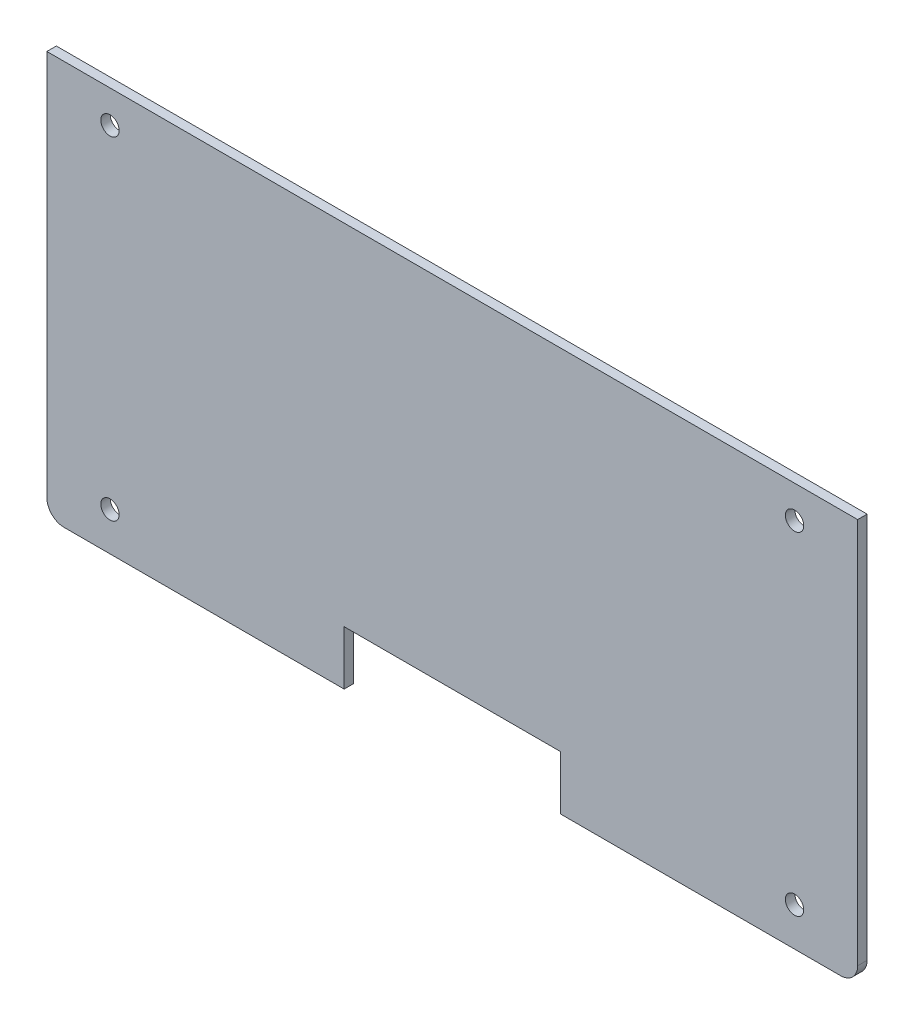
ISO-10303-21;
HEADER;
FILE_DESCRIPTION(('STEP AP214'),'2;1');
FILE_NAME('part.step','',(''),(''),'','','');
FILE_SCHEMA(('AUTOMOTIVE_DESIGN { 1 0 10303 214 1 1 1 1 }'));
ENDSEC;
DATA;
#1=APPLICATION_CONTEXT('core data for automotive mechanical design processes');
#2=APPLICATION_PROTOCOL_DEFINITION('international standard','automotive_design',2000,#1);
#3=PRODUCT_CONTEXT('',#1,'mechanical');
#4=PRODUCT('Part','Part','',(#3));
#5=PRODUCT_RELATED_PRODUCT_CATEGORY('part','',(#4));
#6=PRODUCT_DEFINITION_FORMATION('','',#4);
#7=PRODUCT_DEFINITION_CONTEXT('part definition',#1,'design');
#8=PRODUCT_DEFINITION('design','',#6,#7);
#9=PRODUCT_DEFINITION_SHAPE('','',#8);
#10=(LENGTH_UNIT() NAMED_UNIT(*) SI_UNIT(.MILLI.,.METRE.));
#11=(NAMED_UNIT(*) PLANE_ANGLE_UNIT() SI_UNIT($,.RADIAN.));
#12=(NAMED_UNIT(*) SI_UNIT($,.STERADIAN.) SOLID_ANGLE_UNIT());
#13=UNCERTAINTY_MEASURE_WITH_UNIT(LENGTH_MEASURE(1.E-05),#10,'distance_accuracy_value','');
#14=(GEOMETRIC_REPRESENTATION_CONTEXT(3) GLOBAL_UNCERTAINTY_ASSIGNED_CONTEXT((#13)) GLOBAL_UNIT_ASSIGNED_CONTEXT((#10,
#11,#12)) REPRESENTATION_CONTEXT('',''));
#15=CARTESIAN_POINT('',(0.,0.,0.));
#16=DIRECTION('',(0.,0.,1.));
#17=DIRECTION('',(1.,0.,0.));
#18=AXIS2_PLACEMENT_3D('',#15,#16,#17);
#19=CARTESIAN_POINT('',(0.,0.,0.));
#20=DIRECTION('',(0.,0.,-1.));
#21=DIRECTION('',(-1.,0.,0.));
#22=AXIS2_PLACEMENT_3D('',#19,#20,#21);
#23=PLANE('',#22);
#24=CARTESIAN_POINT('',(-63.325,7.12499999999954,0.));
#25=DIRECTION('',(0.,0.,1.));
#26=DIRECTION('',(1.,0.,0.));
#27=AXIS2_PLACEMENT_3D('',#24,#25,#26);
#28=CIRCLE('',#27,1.7);
#29=CARTESIAN_POINT('',(-61.625,7.12499999999954,0.));
#30=VERTEX_POINT('',#29);
#31=EDGE_CURVE('E224',#30,#30,#28,.T.);
#32=ORIENTED_EDGE('',*,*,#31,.F.);
#33=EDGE_LOOP('',(#32));
#34=FACE_BOUND('',#33,.T.);
#35=CARTESIAN_POINT('',(63.325,68.6599999999995,0.));
#36=DIRECTION('',(0.,0.,1.));
#37=DIRECTION('',(1.,0.,0.));
#38=AXIS2_PLACEMENT_3D('',#35,#36,#37);
#39=CIRCLE('',#38,1.69999999999999);
#40=CARTESIAN_POINT('',(65.025,68.6599999999995,0.));
#41=VERTEX_POINT('',#40);
#42=EDGE_CURVE('E218',#41,#41,#39,.T.);
#43=ORIENTED_EDGE('',*,*,#42,.F.);
#44=EDGE_LOOP('',(#43));
#45=FACE_BOUND('',#44,.T.);
#46=DIRECTION('',(0.,-1.,0.));
#47=VECTOR('',#46,1.);
#48=CARTESIAN_POINT('',(-75.,0.,0.));
#49=LINE('',#48,#47);
#50=CARTESIAN_POINT('',(-75.,74.6599999999995,0.));
#51=VERTEX_POINT('',#50);
#52=CARTESIAN_POINT('',(-75.,3.175,0.));
#53=VERTEX_POINT('',#52);
#54=EDGE_CURVE('E157',#51,#53,#49,.T.);
#55=ORIENTED_EDGE('',*,*,#54,.T.);
#56=CARTESIAN_POINT('',(-71.825,3.175,0.));
#57=DIRECTION('',(0.,0.,-1.));
#58=DIRECTION('',(-1.,0.,0.));
#59=AXIS2_PLACEMENT_3D('',#56,#57,#58);
#60=CIRCLE('',#59,3.175);
#61=CARTESIAN_POINT('',(-71.825,0.,0.));
#62=VERTEX_POINT('',#61);
#63=EDGE_CURVE('E188',#53,#62,#60,.F.);
#64=ORIENTED_EDGE('',*,*,#63,.T.);
#65=DIRECTION('',(1.,0.,0.));
#66=VECTOR('',#65,1.);
#67=CARTESIAN_POINT('',(-75.,0.,0.));
#68=LINE('',#67,#66);
#69=CARTESIAN_POINT('',(-20.,0.,0.));
#70=VERTEX_POINT('',#69);
#71=EDGE_CURVE('E173',#62,#70,#68,.T.);
#72=ORIENTED_EDGE('',*,*,#71,.T.);
#73=DIRECTION('',(0.,-1.,0.));
#74=VECTOR('',#73,1.);
#75=CARTESIAN_POINT('',(-20.,10.,0.));
#76=LINE('',#75,#74);
#77=CARTESIAN_POINT('',(-20.,10.,0.));
#78=VERTEX_POINT('',#77);
#79=EDGE_CURVE('E136',#78,#70,#76,.T.);
#80=ORIENTED_EDGE('',*,*,#79,.F.);
#81=DIRECTION('',(-1.,0.,0.));
#82=VECTOR('',#81,1.);
#83=CARTESIAN_POINT('',(-20.,10.,0.));
#84=LINE('',#83,#82);
#85=CARTESIAN_POINT('',(20.,10.,0.));
#86=VERTEX_POINT('',#85);
#87=EDGE_CURVE('E138',#86,#78,#84,.T.);
#88=ORIENTED_EDGE('',*,*,#87,.F.);
#89=DIRECTION('',(0.,1.,0.));
#90=VECTOR('',#89,1.);
#91=CARTESIAN_POINT('',(20.,10.,0.));
#92=LINE('',#91,#90);
#93=CARTESIAN_POINT('',(20.,0.,0.));
#94=VERTEX_POINT('',#93);
#95=EDGE_CURVE('E145',#94,#86,#92,.T.);
#96=ORIENTED_EDGE('',*,*,#95,.F.);
#97=CARTESIAN_POINT('',(71.825,0.,0.));
#98=VERTEX_POINT('',#97);
#99=EDGE_CURVE('E172',#94,#98,#68,.T.);
#100=ORIENTED_EDGE('',*,*,#99,.T.);
#101=CARTESIAN_POINT('',(71.825,3.175,0.));
#102=DIRECTION('',(0.,0.,-1.));
#103=DIRECTION('',(-1.,0.,0.));
#104=AXIS2_PLACEMENT_3D('',#101,#102,#103);
#105=CIRCLE('',#104,3.175);
#106=CARTESIAN_POINT('',(75.,3.175,0.));
#107=VERTEX_POINT('',#106);
#108=EDGE_CURVE('E186',#98,#107,#105,.F.);
#109=ORIENTED_EDGE('',*,*,#108,.T.);
#110=DIRECTION('',(0.,1.,0.));
#111=VECTOR('',#110,1.);
#112=CARTESIAN_POINT('',(75.,0.,0.));
#113=LINE('',#112,#111);
#114=CARTESIAN_POINT('',(75.,74.6599999999995,0.));
#115=VERTEX_POINT('',#114);
#116=EDGE_CURVE('E175',#107,#115,#113,.T.);
#117=ORIENTED_EDGE('',*,*,#116,.T.);
#118=DIRECTION('',(-1.,0.,0.));
#119=VECTOR('',#118,1.);
#120=CARTESIAN_POINT('',(-75.,74.6599999999995,0.));
#121=LINE('',#120,#119);
#122=EDGE_CURVE('E163',#115,#51,#121,.T.);
#123=ORIENTED_EDGE('',*,*,#122,.T.);
#124=EDGE_LOOP('',(#55,#64,#72,#80,#88,#96,#100,#109,#117,#123));
#125=FACE_BOUND('',#124,.T.);
#126=CARTESIAN_POINT('',(63.325,7.12499999999954,0.));
#127=DIRECTION('',(0.,0.,1.));
#128=DIRECTION('',(1.,0.,0.));
#129=AXIS2_PLACEMENT_3D('',#126,#127,#128);
#130=CIRCLE('',#129,1.69999999999999);
#131=CARTESIAN_POINT('',(65.025,7.12499999999954,0.));
#132=VERTEX_POINT('',#131);
#133=EDGE_CURVE('E210',#132,#132,#130,.T.);
#134=ORIENTED_EDGE('',*,*,#133,.F.);
#135=EDGE_LOOP('',(#134));
#136=FACE_BOUND('',#135,.T.);
#137=CARTESIAN_POINT('',(-63.325,68.6599999999995,0.));
#138=DIRECTION('',(0.,0.,1.));
#139=DIRECTION('',(1.,0.,0.));
#140=AXIS2_PLACEMENT_3D('',#137,#138,#139);
#141=CIRCLE('',#140,1.7);
#142=CARTESIAN_POINT('',(-61.625,68.6599999999995,0.));
#143=VERTEX_POINT('',#142);
#144=EDGE_CURVE('E230',#143,#143,#141,.T.);
#145=ORIENTED_EDGE('',*,*,#144,.F.);
#146=EDGE_LOOP('',(#145));
#147=FACE_BOUND('',#146,.T.);
#148=ADVANCED_FACE('F41',(#34,#45,#125,#136,#147),#23,.F.);
#149=CARTESIAN_POINT('',(-75.,0.,-1.75));
#150=DIRECTION('',(0.,-1.,0.));
#151=DIRECTION('',(0.,0.,-1.));
#152=AXIS2_PLACEMENT_3D('',#149,#150,#151);
#153=PLANE('',#152);
#154=ORIENTED_EDGE('',*,*,#71,.F.);
#155=DIRECTION('',(0.,0.,1.));
#156=VECTOR('',#155,1.);
#157=CARTESIAN_POINT('',(-71.825,0.,-1.75));
#158=LINE('',#157,#156);
#159=CARTESIAN_POINT('',(-71.825,0.,-1.75));
#160=VERTEX_POINT('',#159);
#161=EDGE_CURVE('E124',#62,#160,#158,.F.);
#162=ORIENTED_EDGE('',*,*,#161,.T.);
#163=DIRECTION('',(1.,0.,0.));
#164=VECTOR('',#163,1.);
#165=CARTESIAN_POINT('',(-75.,0.,-1.75));
#166=LINE('',#165,#164);
#167=CARTESIAN_POINT('',(-20.,0.,-1.75));
#168=VERTEX_POINT('',#167);
#169=EDGE_CURVE('E118',#160,#168,#166,.T.);
#170=ORIENTED_EDGE('',*,*,#169,.T.);
#171=DIRECTION('',(0.,0.,1.));
#172=VECTOR('',#171,1.);
#173=CARTESIAN_POINT('',(-20.,0.,-1.751));
#174=LINE('',#173,#172);
#175=EDGE_CURVE('E122',#168,#70,#174,.T.);
#176=ORIENTED_EDGE('',*,*,#175,.T.);
#177=EDGE_LOOP('',(#154,#162,#170,#176));
#178=FACE_BOUND('',#177,.T.);
#179=ADVANCED_FACE('F121',(#178),#153,.T.);
#180=CARTESIAN_POINT('',(-75.,0.,-1.75));
#181=DIRECTION('',(-1.,0.,0.));
#182=DIRECTION('',(0.,0.,1.));
#183=AXIS2_PLACEMENT_3D('',#180,#181,#182);
#184=PLANE('',#183);
#185=DIRECTION('',(0.,-1.,0.));
#186=VECTOR('',#185,1.);
#187=CARTESIAN_POINT('',(-75.,0.,-1.75));
#188=LINE('',#187,#186);
#189=CARTESIAN_POINT('',(-75.,74.6599999999995,-1.75));
#190=VERTEX_POINT('',#189);
#191=CARTESIAN_POINT('',(-75.,3.175,-1.75));
#192=VERTEX_POINT('',#191);
#193=EDGE_CURVE('E161',#190,#192,#188,.T.);
#194=ORIENTED_EDGE('',*,*,#193,.T.);
#195=DIRECTION('',(0.,0.,1.));
#196=VECTOR('',#195,1.);
#197=CARTESIAN_POINT('',(-75.,3.175,-1.75));
#198=LINE('',#197,#196);
#199=EDGE_CURVE('E181',#192,#53,#198,.T.);
#200=ORIENTED_EDGE('',*,*,#199,.T.);
#201=ORIENTED_EDGE('',*,*,#54,.F.);
#202=DIRECTION('',(0.,0.,1.));
#203=VECTOR('',#202,1.);
#204=CARTESIAN_POINT('',(-75.,74.6599999999995,-1.75));
#205=LINE('',#204,#203);
#206=EDGE_CURVE('E179',#190,#51,#205,.T.);
#207=ORIENTED_EDGE('',*,*,#206,.F.);
#208=EDGE_LOOP('',(#194,#200,#201,#207));
#209=FACE_BOUND('',#208,.T.);
#210=ADVANCED_FACE('F243',(#209),#184,.T.);
#211=CARTESIAN_POINT('',(-75.,74.6599999999995,-1.75));
#212=DIRECTION('',(0.,1.,0.));
#213=DIRECTION('',(0.,0.,1.));
#214=AXIS2_PLACEMENT_3D('',#211,#212,#213);
#215=PLANE('',#214);
#216=ORIENTED_EDGE('',*,*,#122,.F.);
#217=DIRECTION('',(0.,0.,1.));
#218=VECTOR('',#217,1.);
#219=CARTESIAN_POINT('',(75.,74.6599999999995,-1.75));
#220=LINE('',#219,#218);
#221=CARTESIAN_POINT('',(75.,74.6599999999995,-1.75));
#222=VERTEX_POINT('',#221);
#223=EDGE_CURVE('E169',#222,#115,#220,.T.);
#224=ORIENTED_EDGE('',*,*,#223,.F.);
#225=DIRECTION('',(-1.,0.,0.));
#226=VECTOR('',#225,1.);
#227=CARTESIAN_POINT('',(-75.,74.6599999999995,-1.75));
#228=LINE('',#227,#226);
#229=EDGE_CURVE('E166',#222,#190,#228,.T.);
#230=ORIENTED_EDGE('',*,*,#229,.T.);
#231=ORIENTED_EDGE('',*,*,#206,.T.);
#232=EDGE_LOOP('',(#216,#224,#230,#231));
#233=FACE_BOUND('',#232,.T.);
#234=ADVANCED_FACE('F250',(#233),#215,.T.);
#235=CARTESIAN_POINT('',(75.,0.,-1.75));
#236=DIRECTION('',(1.,0.,0.));
#237=DIRECTION('',(0.,0.,-1.));
#238=AXIS2_PLACEMENT_3D('',#235,#236,#237);
#239=PLANE('',#238);
#240=ORIENTED_EDGE('',*,*,#116,.F.);
#241=DIRECTION('',(0.,0.,1.));
#242=VECTOR('',#241,1.);
#243=CARTESIAN_POINT('',(75.,3.175,-1.75));
#244=LINE('',#243,#242);
#245=CARTESIAN_POINT('',(75.,3.175,-1.75));
#246=VERTEX_POINT('',#245);
#247=EDGE_CURVE('E11',#107,#246,#244,.F.);
#248=ORIENTED_EDGE('',*,*,#247,.T.);
#249=DIRECTION('',(0.,1.,0.));
#250=VECTOR('',#249,1.);
#251=CARTESIAN_POINT('',(75.,0.,-1.75));
#252=LINE('',#251,#250);
#253=EDGE_CURVE('E127',#246,#222,#252,.T.);
#254=ORIENTED_EDGE('',*,*,#253,.T.);
#255=ORIENTED_EDGE('',*,*,#223,.T.);
#256=EDGE_LOOP('',(#240,#248,#254,#255));
#257=FACE_BOUND('',#256,.T.);
#258=ADVANCED_FACE('F253',(#257),#239,.T.);
#259=CARTESIAN_POINT('',(20.,0.,-1.75));
#260=VERTEX_POINT('',#259);
#261=CARTESIAN_POINT('',(71.825,0.,-1.75));
#262=VERTEX_POINT('',#261);
#263=EDGE_CURVE('E128',#260,#262,#166,.T.);
#264=ORIENTED_EDGE('',*,*,#263,.T.);
#265=DIRECTION('',(0.,0.,1.));
#266=VECTOR('',#265,1.);
#267=CARTESIAN_POINT('',(71.825,0.,-1.75));
#268=LINE('',#267,#266);
#269=EDGE_CURVE('E49',#262,#98,#268,.T.);
#270=ORIENTED_EDGE('',*,*,#269,.T.);
#271=ORIENTED_EDGE('',*,*,#99,.F.);
#272=DIRECTION('',(0.,0.,1.));
#273=VECTOR('',#272,1.);
#274=CARTESIAN_POINT('',(20.,0.,-1.751));
#275=LINE('',#274,#273);
#276=EDGE_CURVE('E137',#260,#94,#275,.T.);
#277=ORIENTED_EDGE('',*,*,#276,.F.);
#278=EDGE_LOOP('',(#264,#270,#271,#277));
#279=FACE_BOUND('',#278,.T.);
#280=ADVANCED_FACE('F198',(#279),#153,.T.);
#281=CARTESIAN_POINT('',(0.,0.,-1.75));
#282=DIRECTION('',(0.,0.,-1.));
#283=DIRECTION('',(-1.,0.,0.));
#284=AXIS2_PLACEMENT_3D('',#281,#282,#283);
#285=PLANE('',#284);
#286=CARTESIAN_POINT('',(-63.325,68.6599999999995,-1.75));
#287=DIRECTION('',(0.,0.,-1.));
#288=DIRECTION('',(-1.,0.,0.));
#289=AXIS2_PLACEMENT_3D('',#286,#287,#288);
#290=CIRCLE('',#289,1.7);
#291=CARTESIAN_POINT('',(-65.025,68.6599999999995,-1.75));
#292=VERTEX_POINT('',#291);
#293=EDGE_CURVE('E227',#292,#292,#290,.T.);
#294=ORIENTED_EDGE('',*,*,#293,.F.);
#295=EDGE_LOOP('',(#294));
#296=FACE_BOUND('',#295,.T.);
#297=CARTESIAN_POINT('',(-63.325,7.12499999999954,-1.75));
#298=DIRECTION('',(0.,0.,-1.));
#299=DIRECTION('',(-1.,0.,0.));
#300=AXIS2_PLACEMENT_3D('',#297,#298,#299);
#301=CIRCLE('',#300,1.7);
#302=CARTESIAN_POINT('',(-65.025,7.12499999999954,-1.75));
#303=VERTEX_POINT('',#302);
#304=EDGE_CURVE('E221',#303,#303,#301,.T.);
#305=ORIENTED_EDGE('',*,*,#304,.F.);
#306=EDGE_LOOP('',(#305));
#307=FACE_BOUND('',#306,.T.);
#308=CARTESIAN_POINT('',(63.325,68.6599999999995,-1.75));
#309=DIRECTION('',(0.,0.,-1.));
#310=DIRECTION('',(-1.,0.,0.));
#311=AXIS2_PLACEMENT_3D('',#308,#309,#310);
#312=CIRCLE('',#311,1.69999999999999);
#313=CARTESIAN_POINT('',(61.6250000000001,68.6599999999995,-1.75));
#314=VERTEX_POINT('',#313);
#315=EDGE_CURVE('E215',#314,#314,#312,.T.);
#316=ORIENTED_EDGE('',*,*,#315,.F.);
#317=EDGE_LOOP('',(#316));
#318=FACE_BOUND('',#317,.T.);
#319=CARTESIAN_POINT('',(63.325,7.12499999999954,-1.75));
#320=DIRECTION('',(0.,0.,-1.));
#321=DIRECTION('',(-1.,0.,0.));
#322=AXIS2_PLACEMENT_3D('',#319,#320,#321);
#323=CIRCLE('',#322,1.69999999999999);
#324=CARTESIAN_POINT('',(61.625,7.12499999999954,-1.75));
#325=VERTEX_POINT('',#324);
#326=EDGE_CURVE('E208',#325,#325,#323,.T.);
#327=ORIENTED_EDGE('',*,*,#326,.F.);
#328=EDGE_LOOP('',(#327));
#329=FACE_BOUND('',#328,.T.);
#330=ORIENTED_EDGE('',*,*,#169,.F.);
#331=CARTESIAN_POINT('',(-71.825,3.175,-1.75));
#332=DIRECTION('',(0.,0.,-1.));
#333=DIRECTION('',(-1.,0.,0.));
#334=AXIS2_PLACEMENT_3D('',#331,#332,#333);
#335=CIRCLE('',#334,3.175);
#336=EDGE_CURVE('E192',#160,#192,#335,.T.);
#337=ORIENTED_EDGE('',*,*,#336,.T.);
#338=ORIENTED_EDGE('',*,*,#193,.F.);
#339=ORIENTED_EDGE('',*,*,#229,.F.);
#340=ORIENTED_EDGE('',*,*,#253,.F.);
#341=CARTESIAN_POINT('',(71.825,3.175,-1.75));
#342=DIRECTION('',(0.,0.,-1.));
#343=DIRECTION('',(-1.,0.,0.));
#344=AXIS2_PLACEMENT_3D('',#341,#342,#343);
#345=CIRCLE('',#344,3.175);
#346=EDGE_CURVE('E56',#246,#262,#345,.T.);
#347=ORIENTED_EDGE('',*,*,#346,.T.);
#348=ORIENTED_EDGE('',*,*,#263,.F.);
#349=DIRECTION('',(0.,1.,0.));
#350=VECTOR('',#349,1.);
#351=CARTESIAN_POINT('',(20.,10.,-1.75));
#352=LINE('',#351,#350);
#353=CARTESIAN_POINT('',(20.,10.,-1.75));
#354=VERTEX_POINT('',#353);
#355=EDGE_CURVE('E147',#260,#354,#352,.T.);
#356=ORIENTED_EDGE('',*,*,#355,.T.);
#357=DIRECTION('',(-1.,0.,0.));
#358=VECTOR('',#357,1.);
#359=CARTESIAN_POINT('',(-20.,10.,-1.75));
#360=LINE('',#359,#358);
#361=CARTESIAN_POINT('',(-20.,10.,-1.75));
#362=VERTEX_POINT('',#361);
#363=EDGE_CURVE('E143',#354,#362,#360,.T.);
#364=ORIENTED_EDGE('',*,*,#363,.T.);
#365=DIRECTION('',(0.,-1.,0.));
#366=VECTOR('',#365,1.);
#367=CARTESIAN_POINT('',(-20.,10.,-1.75));
#368=LINE('',#367,#366);
#369=EDGE_CURVE('E133',#362,#168,#368,.T.);
#370=ORIENTED_EDGE('',*,*,#369,.T.);
#371=EDGE_LOOP('',(#330,#337,#338,#339,#340,#347,#348,#356,#364,#370));
#372=FACE_BOUND('',#371,.T.);
#373=ADVANCED_FACE('F141',(#296,#307,#318,#329,#372),#285,.T.);
#374=CARTESIAN_POINT('',(-20.,10.,-1.751));
#375=DIRECTION('',(-1.,0.,0.));
#376=DIRECTION('',(0.,-1.,0.));
#377=AXIS2_PLACEMENT_3D('',#374,#375,#376);
#378=PLANE('',#377);
#379=DIRECTION('',(0.,0.,1.));
#380=VECTOR('',#379,1.);
#381=CARTESIAN_POINT('',(-20.,10.,-1.751));
#382=LINE('',#381,#380);
#383=EDGE_CURVE('E155',#362,#78,#382,.T.);
#384=ORIENTED_EDGE('',*,*,#383,.T.);
#385=ORIENTED_EDGE('',*,*,#79,.T.);
#386=ORIENTED_EDGE('',*,*,#175,.F.);
#387=ORIENTED_EDGE('',*,*,#369,.F.);
#388=EDGE_LOOP('',(#384,#385,#386,#387));
#389=FACE_BOUND('',#388,.T.);
#390=ADVANCED_FACE('F132',(#389),#378,.F.);
#391=CARTESIAN_POINT('',(-20.,10.,-1.751));
#392=DIRECTION('',(0.,1.,0.));
#393=DIRECTION('',(0.,0.,1.));
#394=AXIS2_PLACEMENT_3D('',#391,#392,#393);
#395=PLANE('',#394);
#396=DIRECTION('',(0.,0.,1.));
#397=VECTOR('',#396,1.);
#398=CARTESIAN_POINT('',(20.,10.,-1.751));
#399=LINE('',#398,#397);
#400=EDGE_CURVE('E158',#354,#86,#399,.T.);
#401=ORIENTED_EDGE('',*,*,#400,.T.);
#402=ORIENTED_EDGE('',*,*,#87,.T.);
#403=ORIENTED_EDGE('',*,*,#383,.F.);
#404=ORIENTED_EDGE('',*,*,#363,.F.);
#405=EDGE_LOOP('',(#401,#402,#403,#404));
#406=FACE_BOUND('',#405,.T.);
#407=ADVANCED_FACE('F289',(#406),#395,.F.);
#408=CARTESIAN_POINT('',(20.,10.,-1.751));
#409=DIRECTION('',(1.,0.,0.));
#410=DIRECTION('',(0.,1.,0.));
#411=AXIS2_PLACEMENT_3D('',#408,#409,#410);
#412=PLANE('',#411);
#413=ORIENTED_EDGE('',*,*,#276,.T.);
#414=ORIENTED_EDGE('',*,*,#95,.T.);
#415=ORIENTED_EDGE('',*,*,#400,.F.);
#416=ORIENTED_EDGE('',*,*,#355,.F.);
#417=EDGE_LOOP('',(#413,#414,#415,#416));
#418=FACE_BOUND('',#417,.T.);
#419=ADVANCED_FACE('F207',(#418),#412,.F.);
#420=CARTESIAN_POINT('',(63.325,7.12499999999954,0.));
#421=DIRECTION('',(0.,0.,1.));
#422=DIRECTION('',(1.,0.,0.));
#423=AXIS2_PLACEMENT_3D('',#420,#421,#422);
#424=CYLINDRICAL_SURFACE('',#423,1.69999999999999);
#425=ORIENTED_EDGE('',*,*,#133,.T.);
#426=EDGE_LOOP('',(#425));
#427=FACE_BOUND('',#426,.T.);
#428=ORIENTED_EDGE('',*,*,#326,.T.);
#429=EDGE_LOOP('',(#428));
#430=FACE_BOUND('',#429,.T.);
#431=ADVANCED_FACE('F284',(#427,#430),#424,.F.);
#432=CARTESIAN_POINT('',(63.325,68.6599999999995,0.));
#433=DIRECTION('',(0.,0.,1.));
#434=DIRECTION('',(1.,0.,0.));
#435=AXIS2_PLACEMENT_3D('',#432,#433,#434);
#436=CYLINDRICAL_SURFACE('',#435,1.69999999999999);
#437=ORIENTED_EDGE('',*,*,#42,.T.);
#438=EDGE_LOOP('',(#437));
#439=FACE_BOUND('',#438,.T.);
#440=ORIENTED_EDGE('',*,*,#315,.T.);
#441=EDGE_LOOP('',(#440));
#442=FACE_BOUND('',#441,.T.);
#443=ADVANCED_FACE('F278',(#439,#442),#436,.F.);
#444=CARTESIAN_POINT('',(-63.325,7.12499999999954,0.));
#445=DIRECTION('',(0.,0.,1.));
#446=DIRECTION('',(1.,0.,0.));
#447=AXIS2_PLACEMENT_3D('',#444,#445,#446);
#448=CYLINDRICAL_SURFACE('',#447,1.7);
#449=ORIENTED_EDGE('',*,*,#31,.T.);
#450=EDGE_LOOP('',(#449));
#451=FACE_BOUND('',#450,.T.);
#452=ORIENTED_EDGE('',*,*,#304,.T.);
#453=EDGE_LOOP('',(#452));
#454=FACE_BOUND('',#453,.T.);
#455=ADVANCED_FACE('F267',(#451,#454),#448,.F.);
#456=CARTESIAN_POINT('',(-63.325,68.6599999999995,0.));
#457=DIRECTION('',(0.,0.,1.));
#458=DIRECTION('',(1.,0.,0.));
#459=AXIS2_PLACEMENT_3D('',#456,#457,#458);
#460=CYLINDRICAL_SURFACE('',#459,1.7);
#461=ORIENTED_EDGE('',*,*,#144,.T.);
#462=EDGE_LOOP('',(#461));
#463=FACE_BOUND('',#462,.T.);
#464=ORIENTED_EDGE('',*,*,#293,.T.);
#465=EDGE_LOOP('',(#464));
#466=FACE_BOUND('',#465,.T.);
#467=ADVANCED_FACE('F234',(#463,#466),#460,.F.);
#468=CARTESIAN_POINT('',(-71.825,3.175,-1.75));
#469=DIRECTION('',(0.,0.,1.));
#470=DIRECTION('',(1.,0.,0.));
#471=AXIS2_PLACEMENT_3D('',#468,#469,#470);
#472=CYLINDRICAL_SURFACE('',#471,3.175);
#473=ORIENTED_EDGE('',*,*,#336,.F.);
#474=ORIENTED_EDGE('',*,*,#161,.F.);
#475=ORIENTED_EDGE('',*,*,#63,.F.);
#476=ORIENTED_EDGE('',*,*,#199,.F.);
#477=EDGE_LOOP('',(#473,#474,#475,#476));
#478=FACE_BOUND('',#477,.T.);
#479=ADVANCED_FACE('F260',(#478),#472,.T.);
#480=CARTESIAN_POINT('',(71.825,3.175,-1.75));
#481=DIRECTION('',(0.,0.,1.));
#482=DIRECTION('',(1.,0.,0.));
#483=AXIS2_PLACEMENT_3D('',#480,#481,#482);
#484=CYLINDRICAL_SURFACE('',#483,3.175);
#485=ORIENTED_EDGE('',*,*,#346,.F.);
#486=ORIENTED_EDGE('',*,*,#247,.F.);
#487=ORIENTED_EDGE('',*,*,#108,.F.);
#488=ORIENTED_EDGE('',*,*,#269,.F.);
#489=EDGE_LOOP('',(#485,#486,#487,#488));
#490=FACE_BOUND('',#489,.T.);
#491=ADVANCED_FACE('F43',(#490),#484,.T.);
#492=CLOSED_SHELL('',(#148,#179,#210,#234,#258,#280,#373,#390,#407,#419,#431,#443,#455,#467,
#479,#491));
#493=MANIFOLD_SOLID_BREP('B2',#492);
#494=ADVANCED_BREP_SHAPE_REPRESENTATION('',(#18,#493),#14);
#495=SHAPE_DEFINITION_REPRESENTATION(#9,#494);
ENDSEC;
END-ISO-10303-21;
